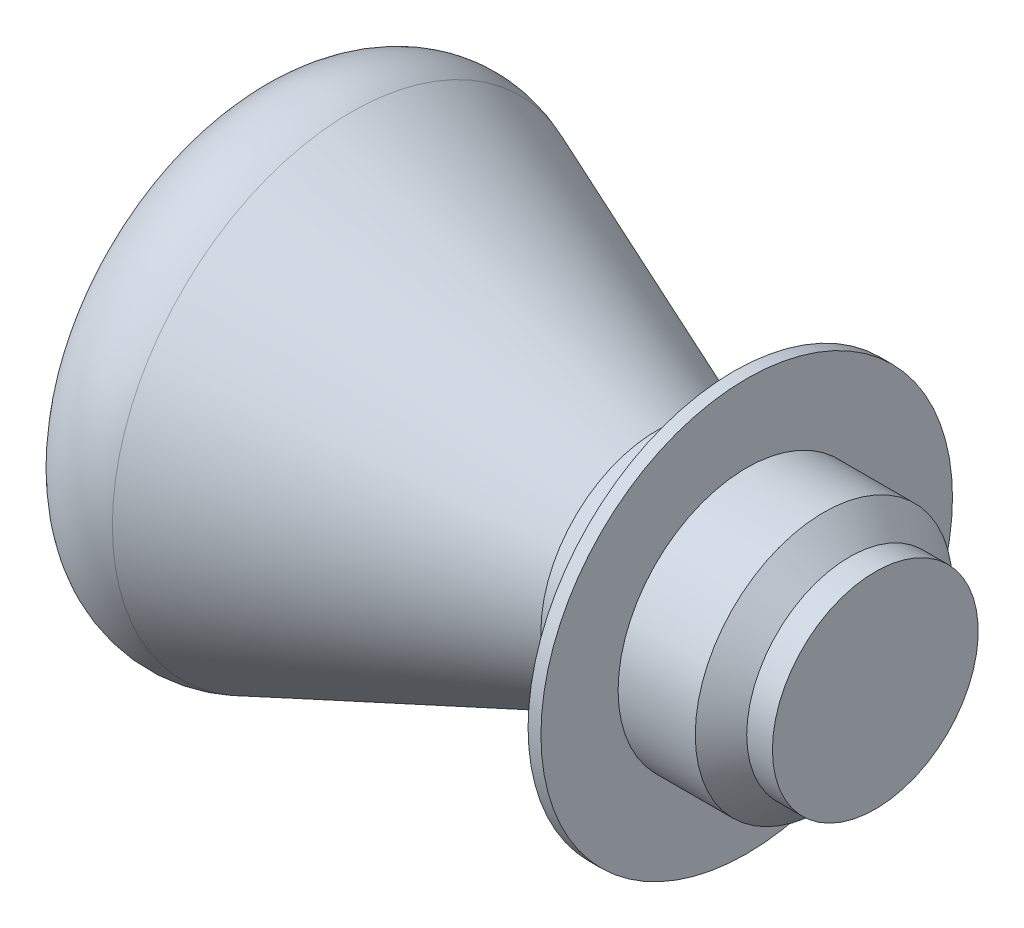
ISO-10303-21;
HEADER;
FILE_DESCRIPTION(('STEP AP214'),'2;1');
FILE_NAME('part.step','',(''),(''),'','','');
FILE_SCHEMA(('AUTOMOTIVE_DESIGN { 1 0 10303 214 1 1 1 1 }'));
ENDSEC;
DATA;
#1=APPLICATION_CONTEXT('core data for automotive mechanical design processes');
#2=APPLICATION_PROTOCOL_DEFINITION('international standard','automotive_design',2000,#1);
#3=PRODUCT_CONTEXT('',#1,'mechanical');
#4=PRODUCT('Part','Part','',(#3));
#5=PRODUCT_RELATED_PRODUCT_CATEGORY('part','',(#4));
#6=PRODUCT_DEFINITION_FORMATION('','',#4);
#7=PRODUCT_DEFINITION_CONTEXT('part definition',#1,'design');
#8=PRODUCT_DEFINITION('design','',#6,#7);
#9=PRODUCT_DEFINITION_SHAPE('','',#8);
#10=(LENGTH_UNIT() NAMED_UNIT(*) SI_UNIT(.MILLI.,.METRE.));
#11=(NAMED_UNIT(*) PLANE_ANGLE_UNIT() SI_UNIT($,.RADIAN.));
#12=(NAMED_UNIT(*) SI_UNIT($,.STERADIAN.) SOLID_ANGLE_UNIT());
#13=UNCERTAINTY_MEASURE_WITH_UNIT(LENGTH_MEASURE(1.E-05),#10,'distance_accuracy_value','');
#14=(GEOMETRIC_REPRESENTATION_CONTEXT(3) GLOBAL_UNCERTAINTY_ASSIGNED_CONTEXT((#13)) GLOBAL_UNIT_ASSIGNED_CONTEXT((#10,
#11,#12)) REPRESENTATION_CONTEXT('',''));
#15=CARTESIAN_POINT('',(0.,0.,0.));
#16=DIRECTION('',(0.,0.,1.));
#17=DIRECTION('',(1.,0.,0.));
#18=AXIS2_PLACEMENT_3D('',#15,#16,#17);
#19=CARTESIAN_POINT('',(0.,0.,0.));
#20=DIRECTION('',(-1.,0.,0.));
#21=DIRECTION('',(0.,0.,1.));
#22=AXIS2_PLACEMENT_3D('',#19,#20,#21);
#23=PLANE('',#22);
#24=CARTESIAN_POINT('',(0.,0.,0.));
#25=DIRECTION('',(-1.,0.,0.));
#26=DIRECTION('',(0.,0.,1.));
#27=AXIS2_PLACEMENT_3D('',#24,#25,#26);
#28=CIRCLE('',#27,4.5);
#29=CARTESIAN_POINT('',(0.,0.,4.5));
#30=VERTEX_POINT('',#29);
#31=EDGE_CURVE('E11',#30,#30,#28,.T.);
#32=ORIENTED_EDGE('',*,*,#31,.F.);
#33=EDGE_LOOP('',(#32));
#34=FACE_BOUND('',#33,.T.);
#35=ADVANCED_FACE('F49',(#34),#23,.F.);
#36=CARTESIAN_POINT('',(-19.8585257724304,0.,0.));
#37=DIRECTION('',(-1.,0.,0.));
#38=DIRECTION('',(0.,0.,1.));
#39=AXIS2_PLACEMENT_3D('',#36,#37,#38);
#40=CYLINDRICAL_SURFACE('',#39,4.5);
#41=CARTESIAN_POINT('',(-3.,0.,0.));
#42=DIRECTION('',(-1.,0.,0.));
#43=DIRECTION('',(0.,0.,1.));
#44=AXIS2_PLACEMENT_3D('',#41,#42,#43);
#45=CIRCLE('',#44,4.5);
#46=CARTESIAN_POINT('',(-3.,0.,4.5));
#47=VERTEX_POINT('',#46);
#48=EDGE_CURVE('E56',#47,#47,#45,.T.);
#49=ORIENTED_EDGE('',*,*,#48,.F.);
#50=EDGE_LOOP('',(#49));
#51=FACE_BOUND('',#50,.T.);
#52=ORIENTED_EDGE('',*,*,#31,.T.);
#53=EDGE_LOOP('',(#52));
#54=FACE_BOUND('',#53,.T.);
#55=ADVANCED_FACE('F83',(#51,#54),#40,.T.);
#56=CARTESIAN_POINT('',(-3.,0.,0.));
#57=DIRECTION('',(-1.,0.,0.));
#58=DIRECTION('',(0.,0.,1.));
#59=AXIS2_PLACEMENT_3D('',#56,#57,#58);
#60=CONICAL_SURFACE('',#59,4.5,0.382760510475255);
#61=CARTESIAN_POINT('',(-14.8795520760162,0.,0.));
#62=DIRECTION('',(-1.,0.,0.));
#63=DIRECTION('',(0.,0.,1.));
#64=AXIS2_PLACEMENT_3D('',#61,#62,#63);
#65=CIRCLE('',#64,9.28291150589457);
#66=CARTESIAN_POINT('',(-14.8795520760162,0.,9.28291150589457));
#67=VERTEX_POINT('',#66);
#68=EDGE_CURVE('E61',#67,#67,#65,.T.);
#69=ORIENTED_EDGE('',*,*,#68,.F.);
#70=EDGE_LOOP('',(#69));
#71=FACE_BOUND('',#70,.T.);
#72=ORIENTED_EDGE('',*,*,#48,.T.);
#73=EDGE_LOOP('',(#72));
#74=FACE_BOUND('',#73,.T.);
#75=ADVANCED_FACE('F78',(#71,#74),#60,.T.);
#76=CARTESIAN_POINT('',(-16.,0.,0.));
#77=DIRECTION('',(-1.,0.,0.));
#78=DIRECTION('',(0.,0.,1.));
#79=AXIS2_PLACEMENT_3D('',#76,#77,#78);
#80=TOROIDAL_SURFACE('',#79,6.49999999999999,3.);
#81=CARTESIAN_POINT('',(-18.8971225679853,0.,0.));
#82=DIRECTION('',(-1.,0.,0.));
#83=DIRECTION('',(0.,0.,1.));
#84=AXIS2_PLACEMENT_3D('',#81,#82,#83);
#85=CIRCLE('',#84,7.27889718581479);
#86=CARTESIAN_POINT('',(-18.8971225679853,0.,7.27889718581479));
#87=VERTEX_POINT('',#86);
#88=EDGE_CURVE('E66',#87,#87,#85,.T.);
#89=ORIENTED_EDGE('',*,*,#88,.F.);
#90=EDGE_LOOP('',(#89));
#91=FACE_BOUND('',#90,.T.);
#92=ORIENTED_EDGE('',*,*,#68,.T.);
#93=EDGE_LOOP('',(#92));
#94=FACE_BOUND('',#93,.T.);
#95=ADVANCED_FACE('F75',(#91,#94),#80,.T.);
#96=CARTESIAN_POINT('',(8.17687088213739,0.,0.));
#97=DIRECTION('',(-1.,0.,0.));
#98=DIRECTION('',(0.,1.,0.));
#99=AXIS2_PLACEMENT_3D('',#96,#97,#98);
#100=SPHERICAL_SURFACE('',#99,28.0353966545678);
#101=ORIENTED_EDGE('',*,*,#88,.T.);
#102=EDGE_LOOP('',(#101));
#103=FACE_BOUND('',#102,.T.);
#104=ADVANCED_FACE('F73',(#103),#100,.T.);
#105=CLOSED_SHELL('',(#35,#55,#75,#95,#104));
#106=MANIFOLD_SOLID_BREP('B2',#105);
#107=CARTESIAN_POINT('',(0.,4.5,0.));
#108=DIRECTION('',(1.,0.,0.));
#109=DIRECTION('',(0.,0.,-1.));
#110=AXIS2_PLACEMENT_3D('',#107,#108,#109);
#111=PLANE('',#110);
#112=CARTESIAN_POINT('',(0.,0.,0.));
#113=DIRECTION('',(-1.,0.,0.));
#114=DIRECTION('',(0.,0.,1.));
#115=AXIS2_PLACEMENT_3D('',#112,#113,#114);
#116=CIRCLE('',#115,4.5);
#117=CARTESIAN_POINT('',(0.,0.,4.5));
#118=VERTEX_POINT('',#117);
#119=EDGE_CURVE('E168',#118,#118,#116,.T.);
#120=ORIENTED_EDGE('',*,*,#119,.T.);
#121=EDGE_LOOP('',(#120));
#122=FACE_BOUND('',#121,.T.);
#123=ADVANCED_FACE('F134',(#122),#111,.F.);
#124=CARTESIAN_POINT('',(5.5,0.,0.));
#125=DIRECTION('',(-1.,0.,0.));
#126=DIRECTION('',(0.,0.,1.));
#127=AXIS2_PLACEMENT_3D('',#124,#125,#126);
#128=PLANE('',#127);
#129=CARTESIAN_POINT('',(5.5,0.,0.));
#130=DIRECTION('',(-1.,0.,0.));
#131=DIRECTION('',(0.,0.,1.));
#132=AXIS2_PLACEMENT_3D('',#129,#130,#131);
#133=CIRCLE('',#132,4.);
#134=CARTESIAN_POINT('',(5.5,0.,4.));
#135=VERTEX_POINT('',#134);
#136=EDGE_CURVE('E48',#135,#135,#133,.T.);
#137=ORIENTED_EDGE('',*,*,#136,.F.);
#138=EDGE_LOOP('',(#137));
#139=FACE_BOUND('',#138,.T.);
#140=ADVANCED_FACE('F222',(#139),#128,.F.);
#141=CARTESIAN_POINT('',(0.,0.,0.));
#142=DIRECTION('',(-1.,0.,0.));
#143=DIRECTION('',(0.,0.,1.));
#144=AXIS2_PLACEMENT_3D('',#141,#142,#143);
#145=CYLINDRICAL_SURFACE('',#144,4.);
#146=CARTESIAN_POINT('',(4.5,0.,0.));
#147=DIRECTION('',(-1.,0.,0.));
#148=DIRECTION('',(0.,0.,1.));
#149=AXIS2_PLACEMENT_3D('',#146,#147,#148);
#150=CIRCLE('',#149,4.);
#151=CARTESIAN_POINT('',(4.5,0.,4.));
#152=VERTEX_POINT('',#151);
#153=EDGE_CURVE('E140',#152,#152,#150,.T.);
#154=ORIENTED_EDGE('',*,*,#153,.F.);
#155=EDGE_LOOP('',(#154));
#156=FACE_BOUND('',#155,.T.);
#157=ORIENTED_EDGE('',*,*,#136,.T.);
#158=EDGE_LOOP('',(#157));
#159=FACE_BOUND('',#158,.T.);
#160=ADVANCED_FACE('F217',(#156,#159),#145,.T.);
#161=CARTESIAN_POINT('',(4.5,0.,0.));
#162=DIRECTION('',(-1.,0.,0.));
#163=DIRECTION('',(0.,0.,1.));
#164=AXIS2_PLACEMENT_3D('',#161,#162,#163);
#165=CONICAL_SURFACE('',#164,4.,0.785398163397448);
#166=CARTESIAN_POINT('',(3.5,0.,0.));
#167=DIRECTION('',(-1.,0.,0.));
#168=DIRECTION('',(0.,0.,1.));
#169=AXIS2_PLACEMENT_3D('',#166,#167,#168);
#170=CIRCLE('',#169,5.);
#171=CARTESIAN_POINT('',(3.5,0.,5.));
#172=VERTEX_POINT('',#171);
#173=EDGE_CURVE('E144',#172,#172,#170,.T.);
#174=ORIENTED_EDGE('',*,*,#173,.F.);
#175=EDGE_LOOP('',(#174));
#176=FACE_BOUND('',#175,.T.);
#177=ORIENTED_EDGE('',*,*,#153,.T.);
#178=EDGE_LOOP('',(#177));
#179=FACE_BOUND('',#178,.T.);
#180=ADVANCED_FACE('F212',(#176,#179),#165,.T.);
#181=CARTESIAN_POINT('',(0.,0.,0.));
#182=DIRECTION('',(-1.,0.,0.));
#183=DIRECTION('',(0.,0.,1.));
#184=AXIS2_PLACEMENT_3D('',#181,#182,#183);
#185=CYLINDRICAL_SURFACE('',#184,5.);
#186=CARTESIAN_POINT('',(0.5,0.,0.));
#187=DIRECTION('',(-1.,0.,0.));
#188=DIRECTION('',(0.,0.,1.));
#189=AXIS2_PLACEMENT_3D('',#186,#187,#188);
#190=CIRCLE('',#189,5.);
#191=CARTESIAN_POINT('',(0.5,0.,5.));
#192=VERTEX_POINT('',#191);
#193=EDGE_CURVE('E148',#192,#192,#190,.T.);
#194=ORIENTED_EDGE('',*,*,#193,.F.);
#195=EDGE_LOOP('',(#194));
#196=FACE_BOUND('',#195,.T.);
#197=ORIENTED_EDGE('',*,*,#173,.T.);
#198=EDGE_LOOP('',(#197));
#199=FACE_BOUND('',#198,.T.);
#200=ADVANCED_FACE('F206',(#196,#199),#185,.T.);
#201=CARTESIAN_POINT('',(0.5,5.,0.));
#202=DIRECTION('',(-1.,0.,0.));
#203=DIRECTION('',(0.,0.,1.));
#204=AXIS2_PLACEMENT_3D('',#201,#202,#203);
#205=PLANE('',#204);
#206=CARTESIAN_POINT('',(0.5,0.,0.));
#207=DIRECTION('',(-1.,0.,0.));
#208=DIRECTION('',(0.,0.,1.));
#209=AXIS2_PLACEMENT_3D('',#206,#207,#208);
#210=CIRCLE('',#209,8.);
#211=CARTESIAN_POINT('',(0.5,0.,8.));
#212=VERTEX_POINT('',#211);
#213=EDGE_CURVE('E153',#212,#212,#210,.T.);
#214=ORIENTED_EDGE('',*,*,#213,.F.);
#215=EDGE_LOOP('',(#214));
#216=FACE_BOUND('',#215,.T.);
#217=ORIENTED_EDGE('',*,*,#193,.T.);
#218=EDGE_LOOP('',(#217));
#219=FACE_BOUND('',#218,.T.);
#220=ADVANCED_FACE('F200',(#216,#219),#205,.F.);
#221=CARTESIAN_POINT('',(0.,0.,0.));
#222=DIRECTION('',(-1.,0.,0.));
#223=DIRECTION('',(0.,0.,1.));
#224=AXIS2_PLACEMENT_3D('',#221,#222,#223);
#225=CYLINDRICAL_SURFACE('',#224,8.);
#226=CARTESIAN_POINT('',(0.,0.,0.));
#227=DIRECTION('',(-1.,0.,0.));
#228=DIRECTION('',(0.,0.,1.));
#229=AXIS2_PLACEMENT_3D('',#226,#227,#228);
#230=CIRCLE('',#229,8.);
#231=CARTESIAN_POINT('',(0.,0.,8.));
#232=VERTEX_POINT('',#231);
#233=EDGE_CURVE('E156',#232,#232,#230,.T.);
#234=ORIENTED_EDGE('',*,*,#233,.F.);
#235=EDGE_LOOP('',(#234));
#236=FACE_BOUND('',#235,.T.);
#237=ORIENTED_EDGE('',*,*,#213,.T.);
#238=EDGE_LOOP('',(#237));
#239=FACE_BOUND('',#238,.T.);
#240=ADVANCED_FACE('F194',(#236,#239),#225,.T.);
#241=CARTESIAN_POINT('',(0.,8.,0.));
#242=DIRECTION('',(1.,0.,0.));
#243=DIRECTION('',(0.,0.,-1.));
#244=AXIS2_PLACEMENT_3D('',#241,#242,#243);
#245=PLANE('',#244);
#246=CARTESIAN_POINT('',(0.,0.,0.));
#247=DIRECTION('',(-1.,0.,0.));
#248=DIRECTION('',(0.,0.,1.));
#249=AXIS2_PLACEMENT_3D('',#246,#247,#248);
#250=CIRCLE('',#249,5.);
#251=CARTESIAN_POINT('',(0.,0.,5.));
#252=VERTEX_POINT('',#251);
#253=EDGE_CURVE('E159',#252,#252,#250,.T.);
#254=ORIENTED_EDGE('',*,*,#253,.F.);
#255=EDGE_LOOP('',(#254));
#256=FACE_BOUND('',#255,.T.);
#257=ORIENTED_EDGE('',*,*,#233,.T.);
#258=EDGE_LOOP('',(#257));
#259=FACE_BOUND('',#258,.T.);
#260=ADVANCED_FACE('F188',(#256,#259),#245,.F.);
#261=CARTESIAN_POINT('',(0.,0.,0.));
#262=DIRECTION('',(-1.,0.,0.));
#263=DIRECTION('',(0.,0.,1.));
#264=AXIS2_PLACEMENT_3D('',#261,#262,#263);
#265=CYLINDRICAL_SURFACE('',#264,5.);
#266=CARTESIAN_POINT('',(-2.,0.,0.));
#267=DIRECTION('',(-1.,0.,0.));
#268=DIRECTION('',(0.,0.,1.));
#269=AXIS2_PLACEMENT_3D('',#266,#267,#268);
#270=CIRCLE('',#269,5.);
#271=CARTESIAN_POINT('',(-2.,0.,5.));
#272=VERTEX_POINT('',#271);
#273=EDGE_CURVE('E162',#272,#272,#270,.T.);
#274=ORIENTED_EDGE('',*,*,#273,.F.);
#275=EDGE_LOOP('',(#274));
#276=FACE_BOUND('',#275,.T.);
#277=ORIENTED_EDGE('',*,*,#253,.T.);
#278=EDGE_LOOP('',(#277));
#279=FACE_BOUND('',#278,.T.);
#280=ADVANCED_FACE('F182',(#276,#279),#265,.T.);
#281=CARTESIAN_POINT('',(-2.,5.,0.));
#282=DIRECTION('',(1.,0.,0.));
#283=DIRECTION('',(0.,0.,-1.));
#284=AXIS2_PLACEMENT_3D('',#281,#282,#283);
#285=PLANE('',#284);
#286=CARTESIAN_POINT('',(-2.,0.,0.));
#287=DIRECTION('',(-1.,0.,0.));
#288=DIRECTION('',(0.,0.,1.));
#289=AXIS2_PLACEMENT_3D('',#286,#287,#288);
#290=CIRCLE('',#289,4.5);
#291=CARTESIAN_POINT('',(-2.,0.,4.5));
#292=VERTEX_POINT('',#291);
#293=EDGE_CURVE('E165',#292,#292,#290,.T.);
#294=ORIENTED_EDGE('',*,*,#293,.F.);
#295=EDGE_LOOP('',(#294));
#296=FACE_BOUND('',#295,.T.);
#297=ORIENTED_EDGE('',*,*,#273,.T.);
#298=EDGE_LOOP('',(#297));
#299=FACE_BOUND('',#298,.T.);
#300=ADVANCED_FACE('F176',(#296,#299),#285,.F.);
#301=CARTESIAN_POINT('',(0.,0.,0.));
#302=DIRECTION('',(-1.,0.,0.));
#303=DIRECTION('',(0.,0.,1.));
#304=AXIS2_PLACEMENT_3D('',#301,#302,#303);
#305=CYLINDRICAL_SURFACE('',#304,4.5);
#306=ORIENTED_EDGE('',*,*,#119,.F.);
#307=EDGE_LOOP('',(#306));
#308=FACE_BOUND('',#307,.T.);
#309=ORIENTED_EDGE('',*,*,#293,.T.);
#310=EDGE_LOOP('',(#309));
#311=FACE_BOUND('',#310,.T.);
#312=ADVANCED_FACE('F173',(#308,#311),#305,.F.);
#313=CLOSED_SHELL('',(#123,#140,#160,#180,#200,#220,#240,#260,#280,#300,#312));
#314=MANIFOLD_SOLID_BREP('B6',#313);
#315=ADVANCED_BREP_SHAPE_REPRESENTATION('',(#18,#106,#314),#14);
#316=SHAPE_DEFINITION_REPRESENTATION(#9,#315);
ENDSEC;
END-ISO-10303-21;
